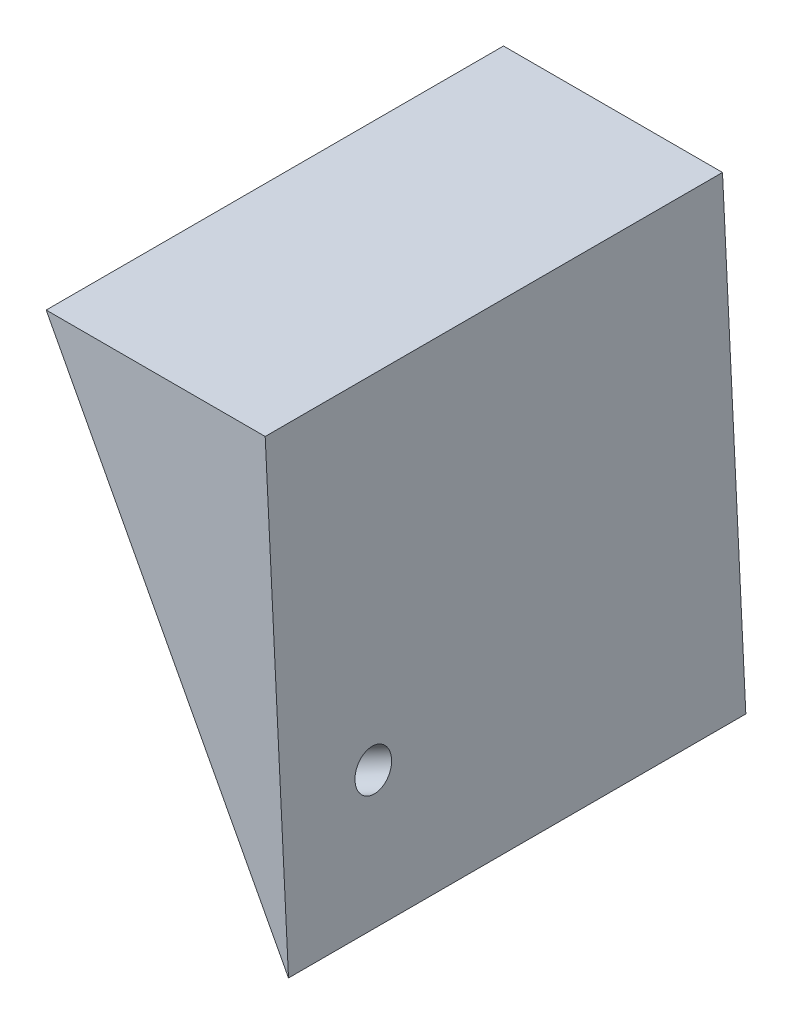
ISO-10303-21;
HEADER;
FILE_DESCRIPTION(('STEP AP214'),'2;1');
FILE_NAME('part.step','',(''),(''),'','','');
FILE_SCHEMA(('AUTOMOTIVE_DESIGN { 1 0 10303 214 1 1 1 1 }'));
ENDSEC;
DATA;
#1=APPLICATION_CONTEXT('core data for automotive mechanical design processes');
#2=APPLICATION_PROTOCOL_DEFINITION('international standard','automotive_design',2000,#1);
#3=PRODUCT_CONTEXT('',#1,'mechanical');
#4=PRODUCT('Part','Part','',(#3));
#5=PRODUCT_RELATED_PRODUCT_CATEGORY('part','',(#4));
#6=PRODUCT_DEFINITION_FORMATION('','',#4);
#7=PRODUCT_DEFINITION_CONTEXT('part definition',#1,'design');
#8=PRODUCT_DEFINITION('design','',#6,#7);
#9=PRODUCT_DEFINITION_SHAPE('','',#8);
#10=(LENGTH_UNIT() NAMED_UNIT(*) SI_UNIT(.MILLI.,.METRE.));
#11=(NAMED_UNIT(*) PLANE_ANGLE_UNIT() SI_UNIT($,.RADIAN.));
#12=(NAMED_UNIT(*) SI_UNIT($,.STERADIAN.) SOLID_ANGLE_UNIT());
#13=UNCERTAINTY_MEASURE_WITH_UNIT(LENGTH_MEASURE(1.E-05),#10,'distance_accuracy_value','');
#14=(GEOMETRIC_REPRESENTATION_CONTEXT(3) GLOBAL_UNCERTAINTY_ASSIGNED_CONTEXT((#13)) GLOBAL_UNIT_ASSIGNED_CONTEXT((#10,
#11,#12)) REPRESENTATION_CONTEXT('',''));
#15=CARTESIAN_POINT('',(0.,0.,0.));
#16=DIRECTION('',(0.,0.,1.));
#17=DIRECTION('',(1.,0.,0.));
#18=AXIS2_PLACEMENT_3D('',#15,#16,#17);
#19=CARTESIAN_POINT('',(-12.2930632240517,19.241346542851,50.));
#20=DIRECTION('',(0.,-1.,0.));
#21=DIRECTION('',(1.,0.,0.));
#22=AXIS2_PLACEMENT_3D('',#19,#20,#21);
#23=PLANE('',#22);
#24=DIRECTION('',(-1.,0.,0.));
#25=VECTOR('',#24,1.);
#26=CARTESIAN_POINT('',(-12.2930632240517,19.241346542851,0.));
#27=LINE('',#26,#25);
#28=CARTESIAN_POINT('',(-12.2930632240517,19.241346542851,0.));
#29=VERTEX_POINT('',#28);
#30=CARTESIAN_POINT('',(-36.2386377440524,19.241346542851,0.));
#31=VERTEX_POINT('',#30);
#32=EDGE_CURVE('E81',#29,#31,#27,.T.);
#33=ORIENTED_EDGE('',*,*,#32,.T.);
#34=DIRECTION('',(0.,0.,-1.));
#35=VECTOR('',#34,1.);
#36=CARTESIAN_POINT('',(-36.2386377440524,19.241346542851,50.));
#37=LINE('',#36,#35);
#38=CARTESIAN_POINT('',(-36.2386377440524,19.241346542851,50.));
#39=VERTEX_POINT('',#38);
#40=EDGE_CURVE('E11',#39,#31,#37,.T.);
#41=ORIENTED_EDGE('',*,*,#40,.F.);
#42=DIRECTION('',(-1.,0.,0.));
#43=VECTOR('',#42,1.);
#44=CARTESIAN_POINT('',(-12.2930632240517,19.241346542851,50.));
#45=LINE('',#44,#43);
#46=CARTESIAN_POINT('',(-12.2930632240517,19.241346542851,50.));
#47=VERTEX_POINT('',#46);
#48=EDGE_CURVE('E74',#47,#39,#45,.T.);
#49=ORIENTED_EDGE('',*,*,#48,.F.);
#50=DIRECTION('',(0.,0.,-1.));
#51=VECTOR('',#50,1.);
#52=CARTESIAN_POINT('',(-12.2930632240517,19.241346542851,50.));
#53=LINE('',#52,#51);
#54=EDGE_CURVE('E82',#47,#29,#53,.T.);
#55=ORIENTED_EDGE('',*,*,#54,.T.);
#56=EDGE_LOOP('',(#33,#41,#49,#55));
#57=FACE_BOUND('',#56,.T.);
#58=ADVANCED_FACE('F33',(#57),#23,.F.);
#59=CARTESIAN_POINT('',(-36.2386377440524,19.241346542851,50.));
#60=DIRECTION('',(0.883603043086009,0.468236758754741,0.));
#61=DIRECTION('',(-0.468236758754741,0.883603043086009,0.));
#62=AXIS2_PLACEMENT_3D('',#59,#60,#61);
#63=PLANE('',#62);
#64=CARTESIAN_POINT('',(-15.829838165013,-19.2718138970308,40.));
#65=DIRECTION('',(-0.883603043086009,-0.468236758754741,0.));
#66=DIRECTION('',(0.468236758754741,-0.883603043086009,0.));
#67=AXIS2_PLACEMENT_3D('',#64,#65,#66);
#68=CIRCLE('',#67,2.);
#69=CARTESIAN_POINT('',(-14.8933646475036,-21.0390199832029,40.));
#70=VERTEX_POINT('',#69);
#71=EDGE_CURVE('E87',#70,#70,#68,.T.);
#72=ORIENTED_EDGE('',*,*,#71,.F.);
#73=EDGE_LOOP('',(#72));
#74=FACE_BOUND('',#73,.T.);
#75=DIRECTION('',(0.468236758754741,-0.883603043086009,0.));
#76=VECTOR('',#75,1.);
#77=CARTESIAN_POINT('',(-36.2386377440524,19.241346542851,0.));
#78=LINE('',#77,#76);
#79=CARTESIAN_POINT('',(-9.74276030120141,-30.758653457149,0.));
#80=VERTEX_POINT('',#79);
#81=EDGE_CURVE('E62',#31,#80,#78,.T.);
#82=ORIENTED_EDGE('',*,*,#81,.T.);
#83=DIRECTION('',(0.,0.,-1.));
#84=VECTOR('',#83,1.);
#85=CARTESIAN_POINT('',(-9.74276030120141,-30.758653457149,50.));
#86=LINE('',#85,#84);
#87=CARTESIAN_POINT('',(-9.74276030120141,-30.758653457149,50.));
#88=VERTEX_POINT('',#87);
#89=EDGE_CURVE('E42',#88,#80,#86,.T.);
#90=ORIENTED_EDGE('',*,*,#89,.F.);
#91=DIRECTION('',(0.468236758754741,-0.883603043086009,0.));
#92=VECTOR('',#91,1.);
#93=CARTESIAN_POINT('',(-36.2386377440524,19.241346542851,50.));
#94=LINE('',#93,#92);
#95=EDGE_CURVE('E70',#39,#88,#94,.T.);
#96=ORIENTED_EDGE('',*,*,#95,.F.);
#97=ORIENTED_EDGE('',*,*,#40,.T.);
#98=EDGE_LOOP('',(#82,#90,#96,#97));
#99=FACE_BOUND('',#98,.T.);
#100=ADVANCED_FACE('F71',(#74,#99),#63,.F.);
#101=CARTESIAN_POINT('',(-9.74276030120141,-30.758653457149,50.));
#102=DIRECTION('',(-0.998701723666158,-0.0509398384984279,0.));
#103=DIRECTION('',(0.0509398384984279,-0.998701723666158,0.));
#104=AXIS2_PLACEMENT_3D('',#101,#102,#103);
#105=PLANE('',#104);
#106=CARTESIAN_POINT('',(-10.4734369101323,-16.4333628733498,40.));
#107=DIRECTION('',(-0.998701723666158,-0.0509398384984279,0.));
#108=DIRECTION('',(0.0509398384984279,-0.998701723666158,0.));
#109=AXIS2_PLACEMENT_3D('',#106,#107,#108);
#110=ELLIPSE('',#109,2.20675583792498,2.);
#111=CARTESIAN_POINT('',(-10.3610251241429,-18.6372537323958,40.));
#112=VERTEX_POINT('',#111);
#113=EDGE_CURVE('E36',#112,#112,#110,.T.);
#114=ORIENTED_EDGE('',*,*,#113,.T.);
#115=EDGE_LOOP('',(#114));
#116=FACE_BOUND('',#115,.T.);
#117=DIRECTION('',(-0.0509398384984279,0.998701723666157,0.));
#118=VECTOR('',#117,1.);
#119=CARTESIAN_POINT('',(-9.74276030120141,-30.758653457149,0.));
#120=LINE('',#119,#118);
#121=EDGE_CURVE('E67',#80,#29,#120,.T.);
#122=ORIENTED_EDGE('',*,*,#121,.T.);
#123=ORIENTED_EDGE('',*,*,#54,.F.);
#124=DIRECTION('',(-0.0509398384984279,0.998701723666157,0.));
#125=VECTOR('',#124,1.);
#126=CARTESIAN_POINT('',(-9.74276030120141,-30.758653457149,50.));
#127=LINE('',#126,#125);
#128=EDGE_CURVE('E50',#88,#47,#127,.T.);
#129=ORIENTED_EDGE('',*,*,#128,.F.);
#130=ORIENTED_EDGE('',*,*,#89,.T.);
#131=EDGE_LOOP('',(#122,#123,#129,#130));
#132=FACE_BOUND('',#131,.T.);
#133=ADVANCED_FACE('F92',(#116,#132),#105,.F.);
#134=CARTESIAN_POINT('',(0.,0.,50.));
#135=DIRECTION('',(0.,0.,-1.));
#136=DIRECTION('',(-1.,0.,0.));
#137=AXIS2_PLACEMENT_3D('',#134,#135,#136);
#138=PLANE('',#137);
#139=ORIENTED_EDGE('',*,*,#48,.T.);
#140=ORIENTED_EDGE('',*,*,#95,.T.);
#141=ORIENTED_EDGE('',*,*,#128,.T.);
#142=EDGE_LOOP('',(#139,#140,#141));
#143=FACE_BOUND('',#142,.T.);
#144=ADVANCED_FACE('F77',(#143),#138,.F.);
#145=CARTESIAN_POINT('',(0.,0.,0.));
#146=DIRECTION('',(0.,0.,-1.));
#147=DIRECTION('',(-1.,0.,0.));
#148=AXIS2_PLACEMENT_3D('',#145,#146,#147);
#149=PLANE('',#148);
#150=ORIENTED_EDGE('',*,*,#32,.F.);
#151=ORIENTED_EDGE('',*,*,#121,.F.);
#152=ORIENTED_EDGE('',*,*,#81,.F.);
#153=EDGE_LOOP('',(#150,#151,#152));
#154=FACE_BOUND('',#153,.T.);
#155=ADVANCED_FACE('F93',(#154),#149,.T.);
#156=CARTESIAN_POINT('',(28.3503139892874,4.14002404070619,40.));
#157=DIRECTION('',(-0.883603043086009,-0.468236758754741,0.));
#158=DIRECTION('',(0.468236758754741,-0.883603043086009,0.));
#159=AXIS2_PLACEMENT_3D('',#156,#157,#158);
#160=CYLINDRICAL_SURFACE('',#159,2.);
#161=ORIENTED_EDGE('',*,*,#71,.T.);
#162=EDGE_LOOP('',(#161));
#163=FACE_BOUND('',#162,.T.);
#164=ORIENTED_EDGE('',*,*,#113,.F.);
#165=EDGE_LOOP('',(#164));
#166=FACE_BOUND('',#165,.T.);
#167=ADVANCED_FACE('F95',(#163,#166),#160,.F.);
#168=CLOSED_SHELL('',(#58,#100,#133,#144,#155,#167));
#169=MANIFOLD_SOLID_BREP('B2',#168);
#170=ADVANCED_BREP_SHAPE_REPRESENTATION('',(#18,#169),#14);
#171=SHAPE_DEFINITION_REPRESENTATION(#9,#170);
ENDSEC;
END-ISO-10303-21;
